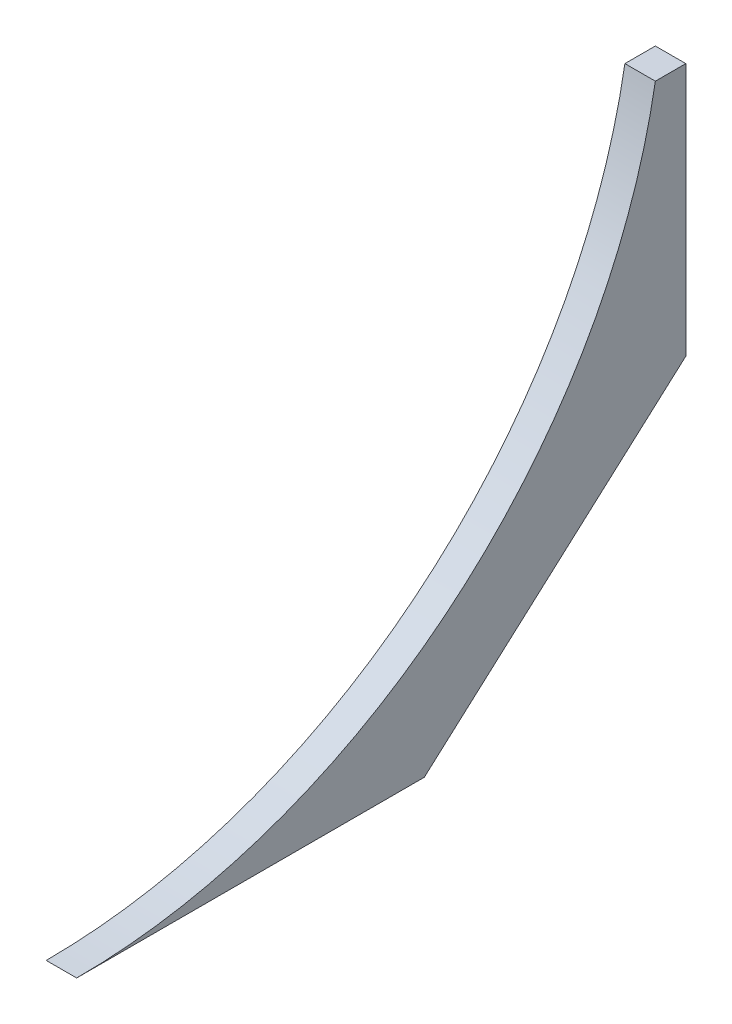
ISO-10303-21;
HEADER;
FILE_DESCRIPTION(('STEP AP214'),'2;1');
FILE_NAME('part.step','',(''),(''),'','','');
FILE_SCHEMA(('AUTOMOTIVE_DESIGN { 1 0 10303 214 1 1 1 1 }'));
ENDSEC;
DATA;
#1=APPLICATION_CONTEXT('core data for automotive mechanical design processes');
#2=APPLICATION_PROTOCOL_DEFINITION('international standard','automotive_design',2000,#1);
#3=PRODUCT_CONTEXT('',#1,'mechanical');
#4=PRODUCT('Part','Part','',(#3));
#5=PRODUCT_RELATED_PRODUCT_CATEGORY('part','',(#4));
#6=PRODUCT_DEFINITION_FORMATION('','',#4);
#7=PRODUCT_DEFINITION_CONTEXT('part definition',#1,'design');
#8=PRODUCT_DEFINITION('design','',#6,#7);
#9=PRODUCT_DEFINITION_SHAPE('','',#8);
#10=(LENGTH_UNIT() NAMED_UNIT(*) SI_UNIT(.MILLI.,.METRE.));
#11=(NAMED_UNIT(*) PLANE_ANGLE_UNIT() SI_UNIT($,.RADIAN.));
#12=(NAMED_UNIT(*) SI_UNIT($,.STERADIAN.) SOLID_ANGLE_UNIT());
#13=UNCERTAINTY_MEASURE_WITH_UNIT(LENGTH_MEASURE(1.E-05),#10,'distance_accuracy_value','');
#14=(GEOMETRIC_REPRESENTATION_CONTEXT(3) GLOBAL_UNCERTAINTY_ASSIGNED_CONTEXT((#13)) GLOBAL_UNIT_ASSIGNED_CONTEXT((#10,
#11,#12)) REPRESENTATION_CONTEXT('',''));
#15=CARTESIAN_POINT('',(0.,0.,0.));
#16=DIRECTION('',(0.,0.,1.));
#17=DIRECTION('',(1.,0.,0.));
#18=AXIS2_PLACEMENT_3D('',#15,#16,#17);
#19=CARTESIAN_POINT('',(-1.5875,-25.4,-31.75));
#20=DIRECTION('',(0.,0.,-1.));
#21=DIRECTION('',(-1.,0.,0.));
#22=AXIS2_PLACEMENT_3D('',#19,#20,#21);
#23=PLANE('',#22);
#24=DIRECTION('',(1.,0.,0.));
#25=VECTOR('',#24,1.);
#26=CARTESIAN_POINT('',(-1.5885,-1.01566499509651,-31.75));
#27=LINE('',#26,#25);
#28=CARTESIAN_POINT('',(-1.5875,-1.01566499509651,-31.75));
#29=VERTEX_POINT('',#28);
#30=CARTESIAN_POINT('',(1.5875,-1.01566499509651,-31.75));
#31=VERTEX_POINT('',#30);
#32=EDGE_CURVE('E56',#29,#31,#27,.T.);
#33=ORIENTED_EDGE('',*,*,#32,.F.);
#34=DIRECTION('',(0.,1.,0.));
#35=VECTOR('',#34,1.);
#36=CARTESIAN_POINT('',(-1.5875,-25.4,-31.75));
#37=LINE('',#36,#35);
#38=CARTESIAN_POINT('',(-1.5875,25.4,-31.75));
#39=VERTEX_POINT('',#38);
#40=EDGE_CURVE('E108',#29,#39,#37,.T.);
#41=ORIENTED_EDGE('',*,*,#40,.T.);
#42=DIRECTION('',(1.,0.,0.));
#43=VECTOR('',#42,1.);
#44=CARTESIAN_POINT('',(-1.5875,25.4,-31.75));
#45=LINE('',#44,#43);
#46=CARTESIAN_POINT('',(1.5875,25.4,-31.75));
#47=VERTEX_POINT('',#46);
#48=EDGE_CURVE('E42',#39,#47,#45,.T.);
#49=ORIENTED_EDGE('',*,*,#48,.T.);
#50=DIRECTION('',(0.,1.,0.));
#51=VECTOR('',#50,1.);
#52=CARTESIAN_POINT('',(1.5875,-25.4,-31.75));
#53=LINE('',#52,#51);
#54=EDGE_CURVE('E100',#31,#47,#53,.T.);
#55=ORIENTED_EDGE('',*,*,#54,.F.);
#56=EDGE_LOOP('',(#33,#41,#49,#55));
#57=FACE_BOUND('',#56,.T.);
#58=ADVANCED_FACE('F39',(#57),#23,.T.);
#59=CARTESIAN_POINT('',(-1.5875,-25.4,31.75));
#60=DIRECTION('',(0.,-1.,0.));
#61=DIRECTION('',(0.,0.,-1.));
#62=AXIS2_PLACEMENT_3D('',#59,#60,#61);
#63=PLANE('',#62);
#64=DIRECTION('',(1.,0.,0.));
#65=VECTOR('',#64,1.);
#66=CARTESIAN_POINT('',(-1.5885,-25.4,-4.49003162574053));
#67=LINE('',#66,#65);
#68=CARTESIAN_POINT('',(-1.5875,-25.4,-4.49003162574053));
#69=VERTEX_POINT('',#68);
#70=CARTESIAN_POINT('',(1.5875,-25.4,-4.49003162574053));
#71=VERTEX_POINT('',#70);
#72=EDGE_CURVE('E87',#69,#71,#67,.T.);
#73=ORIENTED_EDGE('',*,*,#72,.T.);
#74=DIRECTION('',(0.,0.,-1.));
#75=VECTOR('',#74,1.);
#76=CARTESIAN_POINT('',(1.5875,-25.4,31.75));
#77=LINE('',#76,#75);
#78=CARTESIAN_POINT('',(1.5875,-25.4,31.75));
#79=VERTEX_POINT('',#78);
#80=EDGE_CURVE('E96',#79,#71,#77,.T.);
#81=ORIENTED_EDGE('',*,*,#80,.F.);
#82=DIRECTION('',(1.,0.,0.));
#83=VECTOR('',#82,1.);
#84=CARTESIAN_POINT('',(-1.5875,-25.4,31.75));
#85=LINE('',#84,#83);
#86=CARTESIAN_POINT('',(-1.5875,-25.4,31.75));
#87=VERTEX_POINT('',#86);
#88=EDGE_CURVE('E11',#87,#79,#85,.T.);
#89=ORIENTED_EDGE('',*,*,#88,.F.);
#90=DIRECTION('',(0.,0.,-1.));
#91=VECTOR('',#90,1.);
#92=CARTESIAN_POINT('',(-1.5875,-25.4,31.75));
#93=LINE('',#92,#91);
#94=EDGE_CURVE('E98',#87,#69,#93,.T.);
#95=ORIENTED_EDGE('',*,*,#94,.T.);
#96=EDGE_LOOP('',(#73,#81,#89,#95));
#97=FACE_BOUND('',#96,.T.);
#98=ADVANCED_FACE('F95',(#97),#63,.T.);
#99=CARTESIAN_POINT('',(-1.5875,35.81796875,31.75));
#100=DIRECTION('',(1.,0.,0.));
#101=DIRECTION('',(0.,0.,-1.));
#102=AXIS2_PLACEMENT_3D('',#99,#100,#101);
#103=CYLINDRICAL_SURFACE('',#102,61.21796875);
#104=ORIENTED_EDGE('',*,*,#88,.T.);
#105=CARTESIAN_POINT('',(1.5875,35.81796875,31.75));
#106=DIRECTION('',(-1.,0.,0.));
#107=DIRECTION('',(0.,0.,-1.));
#108=AXIS2_PLACEMENT_3D('',#105,#106,#107);
#109=CIRCLE('',#108,61.21796875);
#110=CARTESIAN_POINT('',(1.5875,25.4,-28.575));
#111=VERTEX_POINT('',#110);
#112=EDGE_CURVE('E106',#111,#79,#109,.T.);
#113=ORIENTED_EDGE('',*,*,#112,.F.);
#114=DIRECTION('',(1.,0.,0.));
#115=VECTOR('',#114,1.);
#116=CARTESIAN_POINT('',(-1.5875,25.4,-28.575));
#117=LINE('',#116,#115);
#118=CARTESIAN_POINT('',(-1.5875,25.4,-28.575));
#119=VERTEX_POINT('',#118);
#120=EDGE_CURVE('E48',#119,#111,#117,.T.);
#121=ORIENTED_EDGE('',*,*,#120,.F.);
#122=CARTESIAN_POINT('',(-1.5875,35.81796875,31.75));
#123=DIRECTION('',(-1.,0.,0.));
#124=DIRECTION('',(0.,0.,-1.));
#125=AXIS2_PLACEMENT_3D('',#122,#123,#124);
#126=CIRCLE('',#125,61.21796875);
#127=EDGE_CURVE('E121',#119,#87,#126,.T.);
#128=ORIENTED_EDGE('',*,*,#127,.T.);
#129=EDGE_LOOP('',(#104,#113,#121,#128));
#130=FACE_BOUND('',#129,.T.);
#131=ADVANCED_FACE('F146',(#130),#103,.F.);
#132=CARTESIAN_POINT('',(-1.5875,25.4,-28.575));
#133=DIRECTION('',(0.,1.,0.));
#134=DIRECTION('',(0.,0.,1.));
#135=AXIS2_PLACEMENT_3D('',#132,#133,#134);
#136=PLANE('',#135);
#137=ORIENTED_EDGE('',*,*,#120,.T.);
#138=DIRECTION('',(0.,0.,1.));
#139=VECTOR('',#138,1.);
#140=CARTESIAN_POINT('',(1.5875,25.4,-28.575));
#141=LINE('',#140,#139);
#142=EDGE_CURVE('E114',#47,#111,#141,.T.);
#143=ORIENTED_EDGE('',*,*,#142,.F.);
#144=ORIENTED_EDGE('',*,*,#48,.F.);
#145=DIRECTION('',(0.,0.,1.));
#146=VECTOR('',#145,1.);
#147=CARTESIAN_POINT('',(-1.5875,25.4,-28.575));
#148=LINE('',#147,#146);
#149=EDGE_CURVE('E112',#39,#119,#148,.T.);
#150=ORIENTED_EDGE('',*,*,#149,.T.);
#151=EDGE_LOOP('',(#137,#143,#144,#150));
#152=FACE_BOUND('',#151,.T.);
#153=ADVANCED_FACE('F134',(#152),#136,.T.);
#154=CARTESIAN_POINT('',(-1.5875,35.81796875,31.75));
#155=DIRECTION('',(1.,0.,0.));
#156=DIRECTION('',(0.,0.,-1.));
#157=AXIS2_PLACEMENT_3D('',#154,#155,#156);
#158=PLANE('',#157);
#159=ORIENTED_EDGE('',*,*,#40,.F.);
#160=DIRECTION('',(0.,0.666701268968268,-0.745325041814712));
#161=VECTOR('',#160,1.);
#162=CARTESIAN_POINT('',(-1.5875,-25.4,-4.49003162574053));
#163=LINE('',#162,#161);
#164=EDGE_CURVE('E93',#69,#29,#163,.T.);
#165=ORIENTED_EDGE('',*,*,#164,.F.);
#166=ORIENTED_EDGE('',*,*,#94,.F.);
#167=ORIENTED_EDGE('',*,*,#127,.F.);
#168=ORIENTED_EDGE('',*,*,#149,.F.);
#169=EDGE_LOOP('',(#159,#165,#166,#167,#168));
#170=FACE_BOUND('',#169,.T.);
#171=ADVANCED_FACE('F143',(#170),#158,.F.);
#172=CARTESIAN_POINT('',(1.5875,35.81796875,31.75));
#173=DIRECTION('',(1.,0.,0.));
#174=DIRECTION('',(0.,0.,-1.));
#175=AXIS2_PLACEMENT_3D('',#172,#173,#174);
#176=PLANE('',#175);
#177=DIRECTION('',(0.,-0.666701268968268,0.745325041814712));
#178=VECTOR('',#177,1.);
#179=CARTESIAN_POINT('',(1.5875,-25.4,-4.49003162574053));
#180=LINE('',#179,#178);
#181=EDGE_CURVE('E84',#31,#71,#180,.T.);
#182=ORIENTED_EDGE('',*,*,#181,.F.);
#183=ORIENTED_EDGE('',*,*,#54,.T.);
#184=ORIENTED_EDGE('',*,*,#142,.T.);
#185=ORIENTED_EDGE('',*,*,#112,.T.);
#186=ORIENTED_EDGE('',*,*,#80,.T.);
#187=EDGE_LOOP('',(#182,#183,#184,#185,#186));
#188=FACE_BOUND('',#187,.T.);
#189=ADVANCED_FACE('F103',(#188),#176,.T.);
#190=CARTESIAN_POINT('',(-1.5885,-25.4,-4.49003162574053));
#191=DIRECTION('',(0.,0.745325041814712,0.666701268968268));
#192=DIRECTION('',(0.,-0.666701268968268,0.745325041814712));
#193=AXIS2_PLACEMENT_3D('',#190,#191,#192);
#194=PLANE('',#193);
#195=ORIENTED_EDGE('',*,*,#164,.T.);
#196=ORIENTED_EDGE('',*,*,#32,.T.);
#197=ORIENTED_EDGE('',*,*,#181,.T.);
#198=ORIENTED_EDGE('',*,*,#72,.F.);
#199=EDGE_LOOP('',(#195,#196,#197,#198));
#200=FACE_BOUND('',#199,.T.);
#201=ADVANCED_FACE('F86',(#200),#194,.F.);
#202=CLOSED_SHELL('',(#58,#98,#131,#153,#171,#189,#201));
#203=MANIFOLD_SOLID_BREP('B2',#202);
#204=ADVANCED_BREP_SHAPE_REPRESENTATION('',(#18,#203),#14);
#205=SHAPE_DEFINITION_REPRESENTATION(#9,#204);
ENDSEC;
END-ISO-10303-21;
